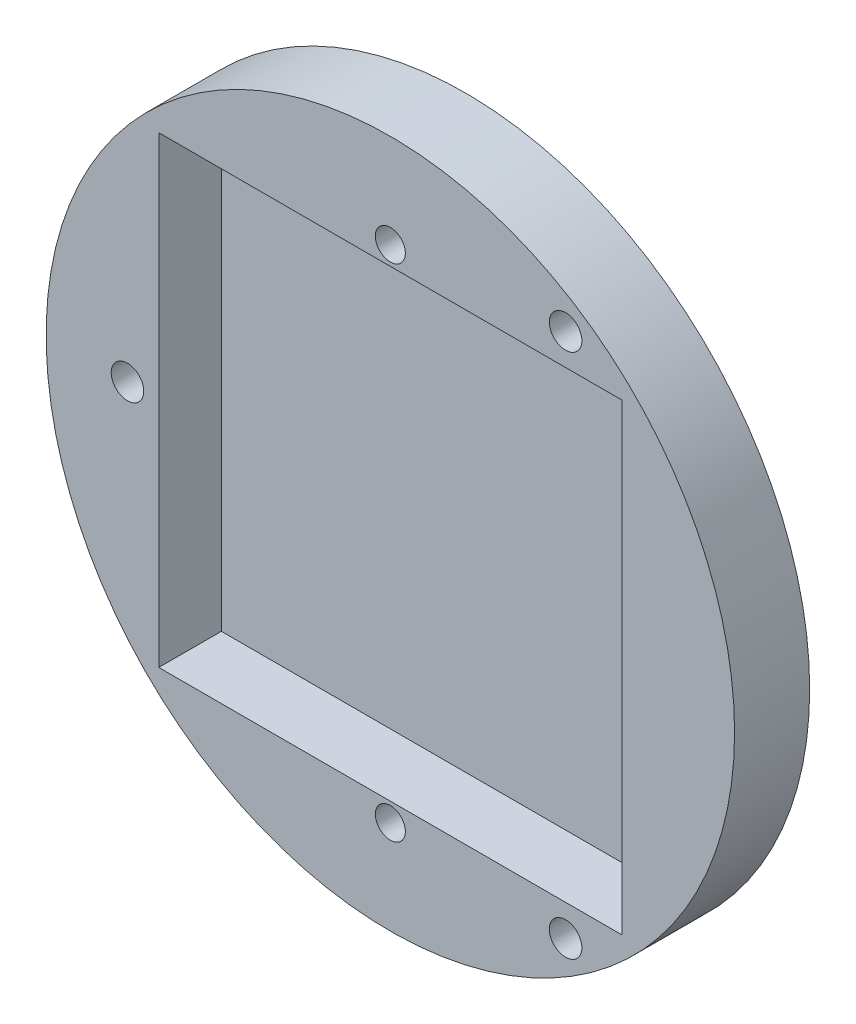
ISO-10303-21;
HEADER;
FILE_DESCRIPTION(('STEP AP214'),'2;1');
FILE_NAME('part.step','',(''),(''),'','','');
FILE_SCHEMA(('AUTOMOTIVE_DESIGN { 1 0 10303 214 1 1 1 1 }'));
ENDSEC;
DATA;
#1=APPLICATION_CONTEXT('core data for automotive mechanical design processes');
#2=APPLICATION_PROTOCOL_DEFINITION('international standard','automotive_design',2000,#1);
#3=PRODUCT_CONTEXT('',#1,'mechanical');
#4=PRODUCT('Part','Part','',(#3));
#5=PRODUCT_RELATED_PRODUCT_CATEGORY('part','',(#4));
#6=PRODUCT_DEFINITION_FORMATION('','',#4);
#7=PRODUCT_DEFINITION_CONTEXT('part definition',#1,'design');
#8=PRODUCT_DEFINITION('design','',#6,#7);
#9=PRODUCT_DEFINITION_SHAPE('','',#8);
#10=(LENGTH_UNIT() NAMED_UNIT(*) SI_UNIT(.MILLI.,.METRE.));
#11=(NAMED_UNIT(*) PLANE_ANGLE_UNIT() SI_UNIT($,.RADIAN.));
#12=(NAMED_UNIT(*) SI_UNIT($,.STERADIAN.) SOLID_ANGLE_UNIT());
#13=UNCERTAINTY_MEASURE_WITH_UNIT(LENGTH_MEASURE(1.E-05),#10,'distance_accuracy_value','');
#14=(GEOMETRIC_REPRESENTATION_CONTEXT(3) GLOBAL_UNCERTAINTY_ASSIGNED_CONTEXT((#13)) GLOBAL_UNIT_ASSIGNED_CONTEXT((#10,
#11,#12)) REPRESENTATION_CONTEXT('',''));
#15=CARTESIAN_POINT('',(0.,0.,0.));
#16=DIRECTION('',(0.,0.,1.));
#17=DIRECTION('',(1.,0.,0.));
#18=AXIS2_PLACEMENT_3D('',#15,#16,#17);
#19=CARTESIAN_POINT('',(0.,0.,0.));
#20=DIRECTION('',(0.,0.,1.));
#21=DIRECTION('',(1.,0.,0.));
#22=AXIS2_PLACEMENT_3D('',#19,#20,#21);
#23=PLANE('',#22);
#24=DIRECTION('',(0.,-1.,0.));
#25=VECTOR('',#24,1.);
#26=CARTESIAN_POINT('',(-2.25,-21.2990381056767,0.));
#27=LINE('',#26,#25);
#28=CARTESIAN_POINT('',(-2.25,-18.7009618943234,0.));
#29=VERTEX_POINT('',#28);
#30=CARTESIAN_POINT('',(-2.25,-21.2990381056767,0.));
#31=VERTEX_POINT('',#30);
#32=EDGE_CURVE('E69',#29,#31,#27,.T.);
#33=ORIENTED_EDGE('',*,*,#32,.T.);
#34=DIRECTION('',(0.866025403784437,-0.500000000000002,0.));
#35=VECTOR('',#34,1.);
#36=CARTESIAN_POINT('',(0.,-22.5980762113533,0.));
#37=LINE('',#36,#35);
#38=CARTESIAN_POINT('',(0.,-22.5980762113533,0.));
#39=VERTEX_POINT('',#38);
#40=EDGE_CURVE('E219',#31,#39,#37,.T.);
#41=ORIENTED_EDGE('',*,*,#40,.T.);
#42=DIRECTION('',(0.866025403784438,0.500000000000002,0.));
#43=VECTOR('',#42,1.);
#44=CARTESIAN_POINT('',(2.25,-21.2990381056767,0.));
#45=LINE('',#44,#43);
#46=CARTESIAN_POINT('',(2.25,-21.2990381056767,0.));
#47=VERTEX_POINT('',#46);
#48=EDGE_CURVE('E223',#39,#47,#45,.T.);
#49=ORIENTED_EDGE('',*,*,#48,.T.);
#50=DIRECTION('',(0.,1.,0.));
#51=VECTOR('',#50,1.);
#52=CARTESIAN_POINT('',(2.25,-18.7009618943234,0.));
#53=LINE('',#52,#51);
#54=CARTESIAN_POINT('',(2.25,-18.7009618943234,0.));
#55=VERTEX_POINT('',#54);
#56=EDGE_CURVE('E227',#47,#55,#53,.T.);
#57=ORIENTED_EDGE('',*,*,#56,.T.);
#58=DIRECTION('',(-0.866025403784438,0.500000000000002,0.));
#59=VECTOR('',#58,1.);
#60=CARTESIAN_POINT('',(0.,-17.4019237886467,0.));
#61=LINE('',#60,#59);
#62=CARTESIAN_POINT('',(0.,-17.4019237886467,0.));
#63=VERTEX_POINT('',#62);
#64=EDGE_CURVE('E231',#55,#63,#61,.T.);
#65=ORIENTED_EDGE('',*,*,#64,.T.);
#66=DIRECTION('',(-0.866025403784437,-0.500000000000002,0.));
#67=VECTOR('',#66,1.);
#68=CARTESIAN_POINT('',(-2.25,-18.7009618943234,0.));
#69=LINE('',#68,#67);
#70=EDGE_CURVE('E201',#63,#29,#69,.T.);
#71=ORIENTED_EDGE('',*,*,#70,.T.);
#72=EDGE_LOOP('',(#33,#41,#49,#57,#65,#71));
#73=FACE_BOUND('',#72,.T.);
#74=CARTESIAN_POINT('',(-21.,0.,0.));
#75=DIRECTION('',(0.,0.,1.));
#76=DIRECTION('',(1.,0.,0.));
#77=AXIS2_PLACEMENT_3D('',#74,#75,#76);
#78=CIRCLE('',#77,1.3);
#79=CARTESIAN_POINT('',(-19.7,0.,0.));
#80=VERTEX_POINT('',#79);
#81=EDGE_CURVE('E267',#80,#80,#78,.T.);
#82=ORIENTED_EDGE('',*,*,#81,.T.);
#83=EDGE_LOOP('',(#82));
#84=FACE_BOUND('',#83,.T.);
#85=CARTESIAN_POINT('',(14.,-21.,0.));
#86=DIRECTION('',(0.,0.,1.));
#87=DIRECTION('',(1.,0.,0.));
#88=AXIS2_PLACEMENT_3D('',#85,#86,#87);
#89=CIRCLE('',#88,1.3);
#90=CARTESIAN_POINT('',(15.3,-21.,0.));
#91=VERTEX_POINT('',#90);
#92=EDGE_CURVE('E275',#91,#91,#89,.T.);
#93=ORIENTED_EDGE('',*,*,#92,.T.);
#94=EDGE_LOOP('',(#93));
#95=FACE_BOUND('',#94,.T.);
#96=CARTESIAN_POINT('',(14.,21.,0.));
#97=DIRECTION('',(0.,0.,1.));
#98=DIRECTION('',(1.,0.,0.));
#99=AXIS2_PLACEMENT_3D('',#96,#97,#98);
#100=CIRCLE('',#99,1.3);
#101=CARTESIAN_POINT('',(15.3,21.,0.));
#102=VERTEX_POINT('',#101);
#103=EDGE_CURVE('E283',#102,#102,#100,.T.);
#104=ORIENTED_EDGE('',*,*,#103,.T.);
#105=EDGE_LOOP('',(#104));
#106=FACE_BOUND('',#105,.T.);
#107=CARTESIAN_POINT('',(0.,0.,0.));
#108=DIRECTION('',(0.,0.,-1.));
#109=DIRECTION('',(-1.,0.,0.));
#110=AXIS2_PLACEMENT_3D('',#107,#108,#109);
#111=CIRCLE('',#110,6.5);
#112=CARTESIAN_POINT('',(-6.5,0.,0.));
#113=VERTEX_POINT('',#112);
#114=EDGE_CURVE('E287',#113,#113,#111,.T.);
#115=ORIENTED_EDGE('',*,*,#114,.F.);
#116=EDGE_LOOP('',(#115));
#117=FACE_BOUND('',#116,.T.);
#118=CARTESIAN_POINT('',(0.,0.,0.));
#119=DIRECTION('',(0.,0.,1.));
#120=DIRECTION('',(1.,0.,0.));
#121=AXIS2_PLACEMENT_3D('',#118,#119,#120);
#122=CIRCLE('',#121,27.5);
#123=CARTESIAN_POINT('',(27.5,0.,0.));
#124=VERTEX_POINT('',#123);
#125=EDGE_CURVE('E305',#124,#124,#122,.T.);
#126=ORIENTED_EDGE('',*,*,#125,.F.);
#127=EDGE_LOOP('',(#126));
#128=FACE_BOUND('',#127,.T.);
#129=DIRECTION('',(0.866025403784437,-0.500000000000002,0.));
#130=VECTOR('',#129,1.);
#131=CARTESIAN_POINT('',(-2.25,18.7009618943234,0.));
#132=LINE('',#131,#130);
#133=CARTESIAN_POINT('',(-2.25,18.7009618943234,0.));
#134=VERTEX_POINT('',#133);
#135=CARTESIAN_POINT('',(0.,17.4019237886467,0.));
#136=VERTEX_POINT('',#135);
#137=EDGE_CURVE('E61',#134,#136,#132,.T.);
#138=ORIENTED_EDGE('',*,*,#137,.T.);
#139=DIRECTION('',(0.866025403784438,0.500000000000002,0.));
#140=VECTOR('',#139,1.);
#141=CARTESIAN_POINT('',(0.,17.4019237886467,0.));
#142=LINE('',#141,#140);
#143=CARTESIAN_POINT('',(2.25,18.7009618943234,0.));
#144=VERTEX_POINT('',#143);
#145=EDGE_CURVE('E184',#136,#144,#142,.T.);
#146=ORIENTED_EDGE('',*,*,#145,.T.);
#147=DIRECTION('',(0.,1.,0.));
#148=VECTOR('',#147,1.);
#149=CARTESIAN_POINT('',(2.25,18.7009618943234,0.));
#150=LINE('',#149,#148);
#151=CARTESIAN_POINT('',(2.25,21.2990381056767,0.));
#152=VERTEX_POINT('',#151);
#153=EDGE_CURVE('E663',#144,#152,#150,.T.);
#154=ORIENTED_EDGE('',*,*,#153,.T.);
#155=DIRECTION('',(-0.866025403784438,0.500000000000002,0.));
#156=VECTOR('',#155,1.);
#157=CARTESIAN_POINT('',(2.25,21.2990381056767,0.));
#158=LINE('',#157,#156);
#159=CARTESIAN_POINT('',(0.,22.5980762113533,0.));
#160=VERTEX_POINT('',#159);
#161=EDGE_CURVE('E658',#152,#160,#158,.T.);
#162=ORIENTED_EDGE('',*,*,#161,.T.);
#163=DIRECTION('',(-0.866025403784437,-0.500000000000002,0.));
#164=VECTOR('',#163,1.);
#165=CARTESIAN_POINT('',(0.,22.5980762113533,0.));
#166=LINE('',#165,#164);
#167=CARTESIAN_POINT('',(-2.25,21.2990381056767,0.));
#168=VERTEX_POINT('',#167);
#169=EDGE_CURVE('E652',#160,#168,#166,.T.);
#170=ORIENTED_EDGE('',*,*,#169,.T.);
#171=DIRECTION('',(0.,-1.,0.));
#172=VECTOR('',#171,1.);
#173=CARTESIAN_POINT('',(-2.25,21.2990381056767,0.));
#174=LINE('',#173,#172);
#175=EDGE_CURVE('E180',#168,#134,#174,.T.);
#176=ORIENTED_EDGE('',*,*,#175,.T.);
#177=EDGE_LOOP('',(#138,#146,#154,#162,#170,#176));
#178=FACE_BOUND('',#177,.T.);
#179=ADVANCED_FACE('F43',(#73,#84,#95,#106,#117,#128,#178),#23,.F.);
#180=CARTESIAN_POINT('',(0.,-20.,0.));
#181=DIRECTION('',(0.,0.,-1.));
#182=DIRECTION('',(-1.,0.,0.));
#183=AXIS2_PLACEMENT_3D('',#180,#181,#182);
#184=CYLINDRICAL_SURFACE('',#183,1.2);
#185=CARTESIAN_POINT('',(0.,-20.,6.));
#186=DIRECTION('',(0.,0.,-1.));
#187=DIRECTION('',(-1.,0.,0.));
#188=AXIS2_PLACEMENT_3D('',#185,#186,#187);
#189=CIRCLE('',#188,1.2);
#190=CARTESIAN_POINT('',(-1.2,-20.,6.));
#191=VERTEX_POINT('',#190);
#192=EDGE_CURVE('E259',#191,#191,#189,.T.);
#193=ORIENTED_EDGE('',*,*,#192,.F.);
#194=EDGE_LOOP('',(#193));
#195=FACE_BOUND('',#194,.T.);
#196=CARTESIAN_POINT('',(0.,-20.,0.8));
#197=DIRECTION('',(0.,0.,-1.));
#198=DIRECTION('',(-1.,0.,0.));
#199=AXIS2_PLACEMENT_3D('',#196,#197,#198);
#200=CIRCLE('',#199,1.2);
#201=CARTESIAN_POINT('',(-1.2,-20.,0.8));
#202=VERTEX_POINT('',#201);
#203=EDGE_CURVE('E47',#202,#202,#200,.F.);
#204=ORIENTED_EDGE('',*,*,#203,.F.);
#205=EDGE_LOOP('',(#204));
#206=FACE_BOUND('',#205,.T.);
#207=ADVANCED_FACE('F363',(#195,#206),#184,.F.);
#208=CARTESIAN_POINT('',(0.,18.5,6.));
#209=DIRECTION('',(0.,1.,0.));
#210=DIRECTION('',(0.,0.,1.));
#211=AXIS2_PLACEMENT_3D('',#208,#209,#210);
#212=PLANE('',#211);
#213=DIRECTION('',(0.,0.,-1.));
#214=VECTOR('',#213,1.);
#215=CARTESIAN_POINT('',(-18.5,18.5,6.));
#216=LINE('',#215,#214);
#217=CARTESIAN_POINT('',(-18.5,18.5,6.));
#218=VERTEX_POINT('',#217);
#219=CARTESIAN_POINT('',(-18.5,18.5,1.));
#220=VERTEX_POINT('',#219);
#221=EDGE_CURVE('E325',#218,#220,#216,.T.);
#222=ORIENTED_EDGE('',*,*,#221,.T.);
#223=DIRECTION('',(1.,0.,0.));
#224=VECTOR('',#223,1.);
#225=CARTESIAN_POINT('',(0.,18.5,1.));
#226=LINE('',#225,#224);
#227=CARTESIAN_POINT('',(18.5,18.5,1.));
#228=VERTEX_POINT('',#227);
#229=EDGE_CURVE('E294',#220,#228,#226,.T.);
#230=ORIENTED_EDGE('',*,*,#229,.T.);
#231=DIRECTION('',(0.,0.,-1.));
#232=VECTOR('',#231,1.);
#233=CARTESIAN_POINT('',(18.5,18.5,6.));
#234=LINE('',#233,#232);
#235=CARTESIAN_POINT('',(18.5,18.5,6.));
#236=VERTEX_POINT('',#235);
#237=EDGE_CURVE('E11',#236,#228,#234,.T.);
#238=ORIENTED_EDGE('',*,*,#237,.F.);
#239=DIRECTION('',(1.,0.,0.));
#240=VECTOR('',#239,1.);
#241=CARTESIAN_POINT('',(0.,18.5,6.));
#242=LINE('',#241,#240);
#243=EDGE_CURVE('E306',#218,#236,#242,.T.);
#244=ORIENTED_EDGE('',*,*,#243,.F.);
#245=EDGE_LOOP('',(#222,#230,#238,#244));
#246=FACE_BOUND('',#245,.T.);
#247=ADVANCED_FACE('F45',(#246),#212,.F.);
#248=CARTESIAN_POINT('',(18.5,0.,6.));
#249=DIRECTION('',(1.,0.,0.));
#250=DIRECTION('',(0.,0.,-1.));
#251=AXIS2_PLACEMENT_3D('',#248,#249,#250);
#252=PLANE('',#251);
#253=ORIENTED_EDGE('',*,*,#237,.T.);
#254=DIRECTION('',(0.,-1.,0.));
#255=VECTOR('',#254,1.);
#256=CARTESIAN_POINT('',(18.5,0.,1.));
#257=LINE('',#256,#255);
#258=CARTESIAN_POINT('',(18.5,-18.5,1.));
#259=VERTEX_POINT('',#258);
#260=EDGE_CURVE('E291',#228,#259,#257,.T.);
#261=ORIENTED_EDGE('',*,*,#260,.T.);
#262=DIRECTION('',(0.,0.,-1.));
#263=VECTOR('',#262,1.);
#264=CARTESIAN_POINT('',(18.5,-18.5,6.));
#265=LINE('',#264,#263);
#266=CARTESIAN_POINT('',(18.5,-18.5,6.));
#267=VERTEX_POINT('',#266);
#268=EDGE_CURVE('E53',#267,#259,#265,.T.);
#269=ORIENTED_EDGE('',*,*,#268,.F.);
#270=DIRECTION('',(0.,-1.,0.));
#271=VECTOR('',#270,1.);
#272=CARTESIAN_POINT('',(18.5,0.,6.));
#273=LINE('',#272,#271);
#274=EDGE_CURVE('E310',#236,#267,#273,.T.);
#275=ORIENTED_EDGE('',*,*,#274,.F.);
#276=EDGE_LOOP('',(#253,#261,#269,#275));
#277=FACE_BOUND('',#276,.T.);
#278=ADVANCED_FACE('F356',(#277),#252,.F.);
#279=CARTESIAN_POINT('',(0.,-18.5,6.));
#280=DIRECTION('',(0.,1.,0.));
#281=DIRECTION('',(0.,0.,1.));
#282=AXIS2_PLACEMENT_3D('',#279,#280,#281);
#283=PLANE('',#282);
#284=DIRECTION('',(1.,0.,0.));
#285=VECTOR('',#284,1.);
#286=CARTESIAN_POINT('',(0.,-18.5,1.));
#287=LINE('',#286,#285);
#288=CARTESIAN_POINT('',(-18.5,-18.5,1.));
#289=VERTEX_POINT('',#288);
#290=EDGE_CURVE('E301',#289,#259,#287,.T.);
#291=ORIENTED_EDGE('',*,*,#290,.F.);
#292=DIRECTION('',(0.,0.,-1.));
#293=VECTOR('',#292,1.);
#294=CARTESIAN_POINT('',(-18.5,-18.5,6.));
#295=LINE('',#294,#293);
#296=CARTESIAN_POINT('',(-18.5,-18.5,6.));
#297=VERTEX_POINT('',#296);
#298=EDGE_CURVE('E332',#297,#289,#295,.T.);
#299=ORIENTED_EDGE('',*,*,#298,.F.);
#300=DIRECTION('',(1.,0.,0.));
#301=VECTOR('',#300,1.);
#302=CARTESIAN_POINT('',(0.,-18.5,6.));
#303=LINE('',#302,#301);
#304=EDGE_CURVE('E313',#297,#267,#303,.T.);
#305=ORIENTED_EDGE('',*,*,#304,.T.);
#306=ORIENTED_EDGE('',*,*,#268,.T.);
#307=EDGE_LOOP('',(#291,#299,#305,#306));
#308=FACE_BOUND('',#307,.T.);
#309=ADVANCED_FACE('F340',(#308),#283,.T.);
#310=CARTESIAN_POINT('',(-18.5,0.,6.));
#311=DIRECTION('',(1.,0.,0.));
#312=DIRECTION('',(0.,0.,-1.));
#313=AXIS2_PLACEMENT_3D('',#310,#311,#312);
#314=PLANE('',#313);
#315=DIRECTION('',(0.,-1.,0.));
#316=VECTOR('',#315,1.);
#317=CARTESIAN_POINT('',(-18.5,0.,1.));
#318=LINE('',#317,#316);
#319=EDGE_CURVE('E297',#220,#289,#318,.T.);
#320=ORIENTED_EDGE('',*,*,#319,.F.);
#321=ORIENTED_EDGE('',*,*,#221,.F.);
#322=DIRECTION('',(0.,-1.,0.));
#323=VECTOR('',#322,1.);
#324=CARTESIAN_POINT('',(-18.5,0.,6.));
#325=LINE('',#324,#323);
#326=EDGE_CURVE('E317',#218,#297,#325,.T.);
#327=ORIENTED_EDGE('',*,*,#326,.T.);
#328=ORIENTED_EDGE('',*,*,#298,.T.);
#329=EDGE_LOOP('',(#320,#321,#327,#328));
#330=FACE_BOUND('',#329,.T.);
#331=ADVANCED_FACE('F348',(#330),#314,.T.);
#332=CARTESIAN_POINT('',(0.,0.,6.));
#333=DIRECTION('',(0.,0.,-1.));
#334=DIRECTION('',(-1.,0.,0.));
#335=AXIS2_PLACEMENT_3D('',#332,#333,#334);
#336=CYLINDRICAL_SURFACE('',#335,27.5);
#337=CARTESIAN_POINT('',(0.,0.,6.));
#338=DIRECTION('',(0.,0.,1.));
#339=DIRECTION('',(1.,0.,0.));
#340=AXIS2_PLACEMENT_3D('',#337,#338,#339);
#341=CIRCLE('',#340,27.5);
#342=CARTESIAN_POINT('',(27.5,0.,6.));
#343=VERTEX_POINT('',#342);
#344=EDGE_CURVE('E321',#343,#343,#341,.T.);
#345=ORIENTED_EDGE('',*,*,#344,.F.);
#346=EDGE_LOOP('',(#345));
#347=FACE_BOUND('',#346,.T.);
#348=ORIENTED_EDGE('',*,*,#125,.T.);
#349=EDGE_LOOP('',(#348));
#350=FACE_BOUND('',#349,.T.);
#351=ADVANCED_FACE('F376',(#347,#350),#336,.T.);
#352=CARTESIAN_POINT('',(0.,0.,6.));
#353=DIRECTION('',(0.,0.,1.));
#354=DIRECTION('',(1.,0.,0.));
#355=AXIS2_PLACEMENT_3D('',#352,#353,#354);
#356=PLANE('',#355);
#357=CARTESIAN_POINT('',(0.,20.,6.));
#358=DIRECTION('',(0.,0.,-1.));
#359=DIRECTION('',(-1.,0.,0.));
#360=AXIS2_PLACEMENT_3D('',#357,#358,#359);
#361=CIRCLE('',#360,1.2);
#362=CARTESIAN_POINT('',(-1.2,20.,6.));
#363=VERTEX_POINT('',#362);
#364=EDGE_CURVE('E255',#363,#363,#361,.T.);
#365=ORIENTED_EDGE('',*,*,#364,.T.);
#366=EDGE_LOOP('',(#365));
#367=FACE_BOUND('',#366,.T.);
#368=ORIENTED_EDGE('',*,*,#192,.T.);
#369=EDGE_LOOP('',(#368));
#370=FACE_BOUND('',#369,.T.);
#371=CARTESIAN_POINT('',(-21.,0.,6.));
#372=DIRECTION('',(0.,0.,1.));
#373=DIRECTION('',(1.,0.,0.));
#374=AXIS2_PLACEMENT_3D('',#371,#372,#373);
#375=CIRCLE('',#374,1.3);
#376=CARTESIAN_POINT('',(-19.7,0.,6.));
#377=VERTEX_POINT('',#376);
#378=EDGE_CURVE('E263',#377,#377,#375,.T.);
#379=ORIENTED_EDGE('',*,*,#378,.F.);
#380=EDGE_LOOP('',(#379));
#381=FACE_BOUND('',#380,.T.);
#382=CARTESIAN_POINT('',(14.,-21.,6.));
#383=DIRECTION('',(0.,0.,1.));
#384=DIRECTION('',(1.,0.,0.));
#385=AXIS2_PLACEMENT_3D('',#382,#383,#384);
#386=CIRCLE('',#385,1.3);
#387=CARTESIAN_POINT('',(15.3,-21.,6.));
#388=VERTEX_POINT('',#387);
#389=EDGE_CURVE('E271',#388,#388,#386,.T.);
#390=ORIENTED_EDGE('',*,*,#389,.F.);
#391=EDGE_LOOP('',(#390));
#392=FACE_BOUND('',#391,.T.);
#393=CARTESIAN_POINT('',(14.,21.,6.));
#394=DIRECTION('',(0.,0.,1.));
#395=DIRECTION('',(1.,0.,0.));
#396=AXIS2_PLACEMENT_3D('',#393,#394,#395);
#397=CIRCLE('',#396,1.3);
#398=CARTESIAN_POINT('',(15.3,21.,6.));
#399=VERTEX_POINT('',#398);
#400=EDGE_CURVE('E279',#399,#399,#397,.T.);
#401=ORIENTED_EDGE('',*,*,#400,.F.);
#402=EDGE_LOOP('',(#401));
#403=FACE_BOUND('',#402,.T.);
#404=ORIENTED_EDGE('',*,*,#243,.T.);
#405=ORIENTED_EDGE('',*,*,#274,.T.);
#406=ORIENTED_EDGE('',*,*,#304,.F.);
#407=ORIENTED_EDGE('',*,*,#326,.F.);
#408=EDGE_LOOP('',(#404,#405,#406,#407));
#409=FACE_BOUND('',#408,.T.);
#410=ORIENTED_EDGE('',*,*,#344,.T.);
#411=EDGE_LOOP('',(#410));
#412=FACE_BOUND('',#411,.T.);
#413=ADVANCED_FACE('F354',(#367,#370,#381,#392,#403,#409,#412),#356,.T.);
#414=CARTESIAN_POINT('',(0.,0.,1.));
#415=DIRECTION('',(0.,0.,1.));
#416=DIRECTION('',(1.,0.,0.));
#417=AXIS2_PLACEMENT_3D('',#414,#415,#416);
#418=PLANE('',#417);
#419=ORIENTED_EDGE('',*,*,#260,.F.);
#420=ORIENTED_EDGE('',*,*,#229,.F.);
#421=ORIENTED_EDGE('',*,*,#319,.T.);
#422=ORIENTED_EDGE('',*,*,#290,.T.);
#423=EDGE_LOOP('',(#419,#420,#421,#422));
#424=FACE_BOUND('',#423,.T.);
#425=ADVANCED_FACE('F345',(#424),#418,.T.);
#426=CARTESIAN_POINT('',(0.,0.,0.));
#427=DIRECTION('',(0.,0.,-1.));
#428=DIRECTION('',(1.,0.,0.));
#429=AXIS2_PLACEMENT_3D('',#426,#427,#428);
#430=SPHERICAL_SURFACE('',#429,6.5);
#431=ORIENTED_EDGE('',*,*,#114,.T.);
#432=EDGE_LOOP('',(#431));
#433=FACE_BOUND('',#432,.T.);
#434=ADVANCED_FACE('F403',(#433),#430,.T.);
#435=CARTESIAN_POINT('',(14.,21.,6.));
#436=DIRECTION('',(0.,0.,1.));
#437=DIRECTION('',(1.,0.,0.));
#438=AXIS2_PLACEMENT_3D('',#435,#436,#437);
#439=CYLINDRICAL_SURFACE('',#438,1.3);
#440=ORIENTED_EDGE('',*,*,#400,.T.);
#441=EDGE_LOOP('',(#440));
#442=FACE_BOUND('',#441,.T.);
#443=ORIENTED_EDGE('',*,*,#103,.F.);
#444=EDGE_LOOP('',(#443));
#445=FACE_BOUND('',#444,.T.);
#446=ADVANCED_FACE('F409',(#442,#445),#439,.F.);
#447=CARTESIAN_POINT('',(14.,-21.,6.));
#448=DIRECTION('',(0.,0.,1.));
#449=DIRECTION('',(1.,0.,0.));
#450=AXIS2_PLACEMENT_3D('',#447,#448,#449);
#451=CYLINDRICAL_SURFACE('',#450,1.3);
#452=ORIENTED_EDGE('',*,*,#389,.T.);
#453=EDGE_LOOP('',(#452));
#454=FACE_BOUND('',#453,.T.);
#455=ORIENTED_EDGE('',*,*,#92,.F.);
#456=EDGE_LOOP('',(#455));
#457=FACE_BOUND('',#456,.T.);
#458=ADVANCED_FACE('F418',(#454,#457),#451,.F.);
#459=CARTESIAN_POINT('',(-21.,0.,6.));
#460=DIRECTION('',(0.,0.,1.));
#461=DIRECTION('',(1.,0.,0.));
#462=AXIS2_PLACEMENT_3D('',#459,#460,#461);
#463=CYLINDRICAL_SURFACE('',#462,1.3);
#464=ORIENTED_EDGE('',*,*,#378,.T.);
#465=EDGE_LOOP('',(#464));
#466=FACE_BOUND('',#465,.T.);
#467=ORIENTED_EDGE('',*,*,#81,.F.);
#468=EDGE_LOOP('',(#467));
#469=FACE_BOUND('',#468,.T.);
#470=ADVANCED_FACE('F425',(#466,#469),#463,.F.);
#471=CARTESIAN_POINT('',(0.,20.,0.));
#472=DIRECTION('',(0.,0.,-1.));
#473=DIRECTION('',(-1.,0.,0.));
#474=AXIS2_PLACEMENT_3D('',#471,#472,#473);
#475=CYLINDRICAL_SURFACE('',#474,1.2);
#476=CARTESIAN_POINT('',(0.,20.,0.8));
#477=DIRECTION('',(0.,0.,1.));
#478=DIRECTION('',(1.,0.,0.));
#479=AXIS2_PLACEMENT_3D('',#476,#477,#478);
#480=CIRCLE('',#479,1.2);
#481=CARTESIAN_POINT('',(1.2,20.,0.8));
#482=VERTEX_POINT('',#481);
#483=EDGE_CURVE('E186',#482,#482,#480,.F.);
#484=ORIENTED_EDGE('',*,*,#483,.T.);
#485=EDGE_LOOP('',(#484));
#486=FACE_BOUND('',#485,.T.);
#487=ORIENTED_EDGE('',*,*,#364,.F.);
#488=EDGE_LOOP('',(#487));
#489=FACE_BOUND('',#488,.T.);
#490=ADVANCED_FACE('F433',(#486,#489),#475,.F.);
#491=CARTESIAN_POINT('',(0.,0.,0.8));
#492=DIRECTION('',(0.,0.,1.));
#493=DIRECTION('',(1.,0.,0.));
#494=AXIS2_PLACEMENT_3D('',#491,#492,#493);
#495=PLANE('',#494);
#496=DIRECTION('',(0.866025403784437,-0.500000000000002,0.));
#497=VECTOR('',#496,1.);
#498=CARTESIAN_POINT('',(-2.25,18.7009618943234,0.8));
#499=LINE('',#498,#497);
#500=CARTESIAN_POINT('',(-2.25,18.7009618943234,0.8));
#501=VERTEX_POINT('',#500);
#502=CARTESIAN_POINT('',(0.,17.4019237886467,0.8));
#503=VERTEX_POINT('',#502);
#504=EDGE_CURVE('E168',#501,#503,#499,.T.);
#505=ORIENTED_EDGE('',*,*,#504,.F.);
#506=DIRECTION('',(0.,-1.,0.));
#507=VECTOR('',#506,1.);
#508=CARTESIAN_POINT('',(-2.25,21.2990381056767,0.8));
#509=LINE('',#508,#507);
#510=CARTESIAN_POINT('',(-2.25,21.2990381056767,0.8));
#511=VERTEX_POINT('',#510);
#512=EDGE_CURVE('E669',#511,#501,#509,.T.);
#513=ORIENTED_EDGE('',*,*,#512,.F.);
#514=DIRECTION('',(-0.866025403784437,-0.500000000000002,0.));
#515=VECTOR('',#514,1.);
#516=CARTESIAN_POINT('',(0.,22.5980762113533,0.8));
#517=LINE('',#516,#515);
#518=CARTESIAN_POINT('',(0.,22.5980762113533,0.8));
#519=VERTEX_POINT('',#518);
#520=EDGE_CURVE('E685',#519,#511,#517,.T.);
#521=ORIENTED_EDGE('',*,*,#520,.F.);
#522=DIRECTION('',(-0.866025403784438,0.500000000000002,0.));
#523=VECTOR('',#522,1.);
#524=CARTESIAN_POINT('',(2.25,21.2990381056767,0.8));
#525=LINE('',#524,#523);
#526=CARTESIAN_POINT('',(2.25,21.2990381056767,0.8));
#527=VERTEX_POINT('',#526);
#528=EDGE_CURVE('E688',#527,#519,#525,.T.);
#529=ORIENTED_EDGE('',*,*,#528,.F.);
#530=DIRECTION('',(0.,1.,0.));
#531=VECTOR('',#530,1.);
#532=CARTESIAN_POINT('',(2.25,18.7009618943234,0.8));
#533=LINE('',#532,#531);
#534=CARTESIAN_POINT('',(2.25,18.7009618943234,0.8));
#535=VERTEX_POINT('',#534);
#536=EDGE_CURVE('E170',#535,#527,#533,.T.);
#537=ORIENTED_EDGE('',*,*,#536,.F.);
#538=DIRECTION('',(0.866025403784438,0.500000000000002,0.));
#539=VECTOR('',#538,1.);
#540=CARTESIAN_POINT('',(0.,17.4019237886467,0.8));
#541=LINE('',#540,#539);
#542=EDGE_CURVE('E163',#503,#535,#541,.T.);
#543=ORIENTED_EDGE('',*,*,#542,.F.);
#544=EDGE_LOOP('',(#505,#513,#521,#529,#537,#543));
#545=FACE_BOUND('',#544,.T.);
#546=ORIENTED_EDGE('',*,*,#483,.F.);
#547=EDGE_LOOP('',(#546));
#548=FACE_BOUND('',#547,.T.);
#549=ADVANCED_FACE('F165',(#545,#548),#495,.F.);
#550=CARTESIAN_POINT('',(-2.25,18.7009618943234,0.8));
#551=DIRECTION('',(0.500000000000002,0.866025403784438,0.));
#552=DIRECTION('',(-0.866025403784438,0.500000000000002,0.));
#553=AXIS2_PLACEMENT_3D('',#550,#551,#552);
#554=PLANE('',#553);
#555=ORIENTED_EDGE('',*,*,#137,.F.);
#556=DIRECTION('',(0.,0.,-1.));
#557=VECTOR('',#556,1.);
#558=CARTESIAN_POINT('',(-2.25,18.7009618943234,0.8));
#559=LINE('',#558,#557);
#560=EDGE_CURVE('E178',#501,#134,#559,.T.);
#561=ORIENTED_EDGE('',*,*,#560,.F.);
#562=ORIENTED_EDGE('',*,*,#504,.T.);
#563=DIRECTION('',(0.,0.,-1.));
#564=VECTOR('',#563,1.);
#565=CARTESIAN_POINT('',(0.,17.4019237886467,0.8));
#566=LINE('',#565,#564);
#567=EDGE_CURVE('E177',#503,#136,#566,.T.);
#568=ORIENTED_EDGE('',*,*,#567,.T.);
#569=EDGE_LOOP('',(#555,#561,#562,#568));
#570=FACE_BOUND('',#569,.T.);
#571=ADVANCED_FACE('F176',(#570),#554,.T.);
#572=CARTESIAN_POINT('',(0.,17.4019237886467,0.8));
#573=DIRECTION('',(-0.500000000000002,0.866025403784438,0.));
#574=DIRECTION('',(-0.866025403784438,-0.500000000000002,0.));
#575=AXIS2_PLACEMENT_3D('',#572,#573,#574);
#576=PLANE('',#575);
#577=ORIENTED_EDGE('',*,*,#145,.F.);
#578=ORIENTED_EDGE('',*,*,#567,.F.);
#579=ORIENTED_EDGE('',*,*,#542,.T.);
#580=DIRECTION('',(0.,0.,-1.));
#581=VECTOR('',#580,1.);
#582=CARTESIAN_POINT('',(2.25,18.7009618943234,0.8));
#583=LINE('',#582,#581);
#584=EDGE_CURVE('E187',#535,#144,#583,.T.);
#585=ORIENTED_EDGE('',*,*,#584,.T.);
#586=EDGE_LOOP('',(#577,#578,#579,#585));
#587=FACE_BOUND('',#586,.T.);
#588=ADVANCED_FACE('F182',(#587),#576,.T.);
#589=CARTESIAN_POINT('',(2.25,18.7009618943234,0.8));
#590=DIRECTION('',(-1.,0.,0.));
#591=DIRECTION('',(0.,-1.,0.));
#592=AXIS2_PLACEMENT_3D('',#589,#590,#591);
#593=PLANE('',#592);
#594=ORIENTED_EDGE('',*,*,#153,.F.);
#595=ORIENTED_EDGE('',*,*,#584,.F.);
#596=ORIENTED_EDGE('',*,*,#536,.T.);
#597=DIRECTION('',(0.,0.,-1.));
#598=VECTOR('',#597,1.);
#599=CARTESIAN_POINT('',(2.25,21.2990381056767,0.8));
#600=LINE('',#599,#598);
#601=EDGE_CURVE('E192',#527,#152,#600,.T.);
#602=ORIENTED_EDGE('',*,*,#601,.T.);
#603=EDGE_LOOP('',(#594,#595,#596,#602));
#604=FACE_BOUND('',#603,.T.);
#605=ADVANCED_FACE('F460',(#604),#593,.T.);
#606=CARTESIAN_POINT('',(2.25,21.2990381056767,0.8));
#607=DIRECTION('',(-0.500000000000002,-0.866025403784438,0.));
#608=DIRECTION('',(0.866025403784438,-0.500000000000002,0.));
#609=AXIS2_PLACEMENT_3D('',#606,#607,#608);
#610=PLANE('',#609);
#611=ORIENTED_EDGE('',*,*,#161,.F.);
#612=ORIENTED_EDGE('',*,*,#601,.F.);
#613=ORIENTED_EDGE('',*,*,#528,.T.);
#614=DIRECTION('',(0.,0.,-1.));
#615=VECTOR('',#614,1.);
#616=CARTESIAN_POINT('',(0.,22.5980762113533,0.8));
#617=LINE('',#616,#615);
#618=EDGE_CURVE('E672',#519,#160,#617,.T.);
#619=ORIENTED_EDGE('',*,*,#618,.T.);
#620=EDGE_LOOP('',(#611,#612,#613,#619));
#621=FACE_BOUND('',#620,.T.);
#622=ADVANCED_FACE('F467',(#621),#610,.T.);
#623=CARTESIAN_POINT('',(0.,22.5980762113533,0.8));
#624=DIRECTION('',(0.500000000000002,-0.866025403784437,0.));
#625=DIRECTION('',(0.866025403784437,0.500000000000002,0.));
#626=AXIS2_PLACEMENT_3D('',#623,#624,#625);
#627=PLANE('',#626);
#628=ORIENTED_EDGE('',*,*,#169,.F.);
#629=ORIENTED_EDGE('',*,*,#618,.F.);
#630=ORIENTED_EDGE('',*,*,#520,.T.);
#631=DIRECTION('',(0.,0.,-1.));
#632=VECTOR('',#631,1.);
#633=CARTESIAN_POINT('',(-2.25,21.2990381056767,0.8));
#634=LINE('',#633,#632);
#635=EDGE_CURVE('E649',#511,#168,#634,.T.);
#636=ORIENTED_EDGE('',*,*,#635,.T.);
#637=EDGE_LOOP('',(#628,#629,#630,#636));
#638=FACE_BOUND('',#637,.T.);
#639=ADVANCED_FACE('F475',(#638),#627,.T.);
#640=CARTESIAN_POINT('',(-2.25,21.2990381056767,0.8));
#641=DIRECTION('',(1.,0.,0.));
#642=DIRECTION('',(0.,0.,-1.));
#643=AXIS2_PLACEMENT_3D('',#640,#641,#642);
#644=PLANE('',#643);
#645=ORIENTED_EDGE('',*,*,#175,.F.);
#646=ORIENTED_EDGE('',*,*,#635,.F.);
#647=ORIENTED_EDGE('',*,*,#512,.T.);
#648=ORIENTED_EDGE('',*,*,#560,.T.);
#649=EDGE_LOOP('',(#645,#646,#647,#648));
#650=FACE_BOUND('',#649,.T.);
#651=ADVANCED_FACE('F483',(#650),#644,.T.);
#652=CARTESIAN_POINT('',(0.,0.,0.8));
#653=DIRECTION('',(0.,0.,-1.));
#654=DIRECTION('',(-1.,0.,0.));
#655=AXIS2_PLACEMENT_3D('',#652,#653,#654);
#656=PLANE('',#655);
#657=DIRECTION('',(0.,-1.,0.));
#658=VECTOR('',#657,1.);
#659=CARTESIAN_POINT('',(-2.25,-21.2990381056767,0.8));
#660=LINE('',#659,#658);
#661=CARTESIAN_POINT('',(-2.25,-18.7009618943234,0.8));
#662=VERTEX_POINT('',#661);
#663=CARTESIAN_POINT('',(-2.25,-21.2990381056767,0.8));
#664=VERTEX_POINT('',#663);
#665=EDGE_CURVE('E196',#662,#664,#660,.T.);
#666=ORIENTED_EDGE('',*,*,#665,.F.);
#667=DIRECTION('',(-0.866025403784437,-0.500000000000002,0.));
#668=VECTOR('',#667,1.);
#669=CARTESIAN_POINT('',(-2.25,-18.7009618943234,0.8));
#670=LINE('',#669,#668);
#671=CARTESIAN_POINT('',(0.,-17.4019237886467,0.8));
#672=VERTEX_POINT('',#671);
#673=EDGE_CURVE('E213',#672,#662,#670,.T.);
#674=ORIENTED_EDGE('',*,*,#673,.F.);
#675=DIRECTION('',(-0.866025403784438,0.500000000000002,0.));
#676=VECTOR('',#675,1.);
#677=CARTESIAN_POINT('',(0.,-17.4019237886467,0.8));
#678=LINE('',#677,#676);
#679=CARTESIAN_POINT('',(2.25,-18.7009618943234,0.8));
#680=VERTEX_POINT('',#679);
#681=EDGE_CURVE('E210',#680,#672,#678,.T.);
#682=ORIENTED_EDGE('',*,*,#681,.F.);
#683=DIRECTION('',(0.,1.,0.));
#684=VECTOR('',#683,1.);
#685=CARTESIAN_POINT('',(2.25,-18.7009618943234,0.8));
#686=LINE('',#685,#684);
#687=CARTESIAN_POINT('',(2.25,-21.2990381056767,0.8));
#688=VERTEX_POINT('',#687);
#689=EDGE_CURVE('E207',#688,#680,#686,.T.);
#690=ORIENTED_EDGE('',*,*,#689,.F.);
#691=DIRECTION('',(0.866025403784438,0.500000000000002,0.));
#692=VECTOR('',#691,1.);
#693=CARTESIAN_POINT('',(2.25,-21.2990381056767,0.8));
#694=LINE('',#693,#692);
#695=CARTESIAN_POINT('',(0.,-22.5980762113533,0.8));
#696=VERTEX_POINT('',#695);
#697=EDGE_CURVE('E204',#696,#688,#694,.T.);
#698=ORIENTED_EDGE('',*,*,#697,.F.);
#699=DIRECTION('',(0.866025403784437,-0.500000000000002,0.));
#700=VECTOR('',#699,1.);
#701=CARTESIAN_POINT('',(0.,-22.5980762113533,0.8));
#702=LINE('',#701,#700);
#703=EDGE_CURVE('E200',#664,#696,#702,.T.);
#704=ORIENTED_EDGE('',*,*,#703,.F.);
#705=EDGE_LOOP('',(#666,#674,#682,#690,#698,#704));
#706=FACE_BOUND('',#705,.T.);
#707=ORIENTED_EDGE('',*,*,#203,.T.);
#708=EDGE_LOOP('',(#707));
#709=FACE_BOUND('',#708,.T.);
#710=ADVANCED_FACE('F491',(#706,#709),#656,.T.);
#711=CARTESIAN_POINT('',(-2.25,-21.2990381056767,0.8));
#712=DIRECTION('',(1.,0.,0.));
#713=DIRECTION('',(0.,0.,-1.));
#714=AXIS2_PLACEMENT_3D('',#711,#712,#713);
#715=PLANE('',#714);
#716=ORIENTED_EDGE('',*,*,#32,.F.);
#717=DIRECTION('',(0.,0.,-1.));
#718=VECTOR('',#717,1.);
#719=CARTESIAN_POINT('',(-2.25,-18.7009618943234,0.8));
#720=LINE('',#719,#718);
#721=EDGE_CURVE('E216',#662,#29,#720,.T.);
#722=ORIENTED_EDGE('',*,*,#721,.F.);
#723=ORIENTED_EDGE('',*,*,#665,.T.);
#724=DIRECTION('',(0.,0.,-1.));
#725=VECTOR('',#724,1.);
#726=CARTESIAN_POINT('',(-2.25,-21.2990381056767,0.8));
#727=LINE('',#726,#725);
#728=EDGE_CURVE('E252',#664,#31,#727,.T.);
#729=ORIENTED_EDGE('',*,*,#728,.T.);
#730=EDGE_LOOP('',(#716,#722,#723,#729));
#731=FACE_BOUND('',#730,.T.);
#732=ADVANCED_FACE('F499',(#731),#715,.T.);
#733=CARTESIAN_POINT('',(0.,-22.5980762113533,0.8));
#734=DIRECTION('',(0.500000000000002,0.866025403784437,0.));
#735=DIRECTION('',(-0.866025403784437,0.500000000000002,0.));
#736=AXIS2_PLACEMENT_3D('',#733,#734,#735);
#737=PLANE('',#736);
#738=ORIENTED_EDGE('',*,*,#40,.F.);
#739=ORIENTED_EDGE('',*,*,#728,.F.);
#740=ORIENTED_EDGE('',*,*,#703,.T.);
#741=DIRECTION('',(0.,0.,-1.));
#742=VECTOR('',#741,1.);
#743=CARTESIAN_POINT('',(0.,-22.5980762113533,0.8));
#744=LINE('',#743,#742);
#745=EDGE_CURVE('E249',#696,#39,#744,.T.);
#746=ORIENTED_EDGE('',*,*,#745,.T.);
#747=EDGE_LOOP('',(#738,#739,#740,#746));
#748=FACE_BOUND('',#747,.T.);
#749=ADVANCED_FACE('F507',(#748),#737,.T.);
#750=CARTESIAN_POINT('',(2.25,-21.2990381056767,0.8));
#751=DIRECTION('',(-0.500000000000002,0.866025403784438,0.));
#752=DIRECTION('',(-0.866025403784438,-0.500000000000002,0.));
#753=AXIS2_PLACEMENT_3D('',#750,#751,#752);
#754=PLANE('',#753);
#755=ORIENTED_EDGE('',*,*,#48,.F.);
#756=ORIENTED_EDGE('',*,*,#745,.F.);
#757=ORIENTED_EDGE('',*,*,#697,.T.);
#758=DIRECTION('',(0.,0.,-1.));
#759=VECTOR('',#758,1.);
#760=CARTESIAN_POINT('',(2.25,-21.2990381056767,0.8));
#761=LINE('',#760,#759);
#762=EDGE_CURVE('E246',#688,#47,#761,.T.);
#763=ORIENTED_EDGE('',*,*,#762,.T.);
#764=EDGE_LOOP('',(#755,#756,#757,#763));
#765=FACE_BOUND('',#764,.T.);
#766=ADVANCED_FACE('F514',(#765),#754,.T.);
#767=CARTESIAN_POINT('',(2.25,-18.7009618943234,0.8));
#768=DIRECTION('',(-1.,0.,0.));
#769=DIRECTION('',(0.,-1.,0.));
#770=AXIS2_PLACEMENT_3D('',#767,#768,#769);
#771=PLANE('',#770);
#772=ORIENTED_EDGE('',*,*,#56,.F.);
#773=ORIENTED_EDGE('',*,*,#762,.F.);
#774=ORIENTED_EDGE('',*,*,#689,.T.);
#775=DIRECTION('',(0.,0.,-1.));
#776=VECTOR('',#775,1.);
#777=CARTESIAN_POINT('',(2.25,-18.7009618943234,0.8));
#778=LINE('',#777,#776);
#779=EDGE_CURVE('E243',#680,#55,#778,.T.);
#780=ORIENTED_EDGE('',*,*,#779,.T.);
#781=EDGE_LOOP('',(#772,#773,#774,#780));
#782=FACE_BOUND('',#781,.T.);
#783=ADVANCED_FACE('F522',(#782),#771,.T.);
#784=CARTESIAN_POINT('',(0.,-17.4019237886467,0.8));
#785=DIRECTION('',(-0.500000000000002,-0.866025403784438,0.));
#786=DIRECTION('',(0.866025403784438,-0.500000000000002,0.));
#787=AXIS2_PLACEMENT_3D('',#784,#785,#786);
#788=PLANE('',#787);
#789=ORIENTED_EDGE('',*,*,#64,.F.);
#790=ORIENTED_EDGE('',*,*,#779,.F.);
#791=ORIENTED_EDGE('',*,*,#681,.T.);
#792=DIRECTION('',(0.,0.,-1.));
#793=VECTOR('',#792,1.);
#794=CARTESIAN_POINT('',(0.,-17.4019237886467,0.8));
#795=LINE('',#794,#793);
#796=EDGE_CURVE('E240',#672,#63,#795,.T.);
#797=ORIENTED_EDGE('',*,*,#796,.T.);
#798=EDGE_LOOP('',(#789,#790,#791,#797));
#799=FACE_BOUND('',#798,.T.);
#800=ADVANCED_FACE('F530',(#799),#788,.T.);
#801=CARTESIAN_POINT('',(-2.25,-18.7009618943234,0.8));
#802=DIRECTION('',(0.500000000000002,-0.866025403784438,0.));
#803=DIRECTION('',(0.866025403784438,0.500000000000002,0.));
#804=AXIS2_PLACEMENT_3D('',#801,#802,#803);
#805=PLANE('',#804);
#806=ORIENTED_EDGE('',*,*,#70,.F.);
#807=ORIENTED_EDGE('',*,*,#796,.F.);
#808=ORIENTED_EDGE('',*,*,#673,.T.);
#809=ORIENTED_EDGE('',*,*,#721,.T.);
#810=EDGE_LOOP('',(#806,#807,#808,#809));
#811=FACE_BOUND('',#810,.T.);
#812=ADVANCED_FACE('F538',(#811),#805,.T.);
#813=CLOSED_SHELL('',(#179,#207,#247,#278,#309,#331,#351,#413,#425,#434,#446,#458,#470,#490,
#549,#571,#588,#605,#622,#639,#651,#710,#732,#749,#766,#783,#800,#812));
#814=MANIFOLD_SOLID_BREP('B2',#813);
#815=ADVANCED_BREP_SHAPE_REPRESENTATION('',(#18,#814),#14);
#816=SHAPE_DEFINITION_REPRESENTATION(#9,#815);
ENDSEC;
END-ISO-10303-21;
